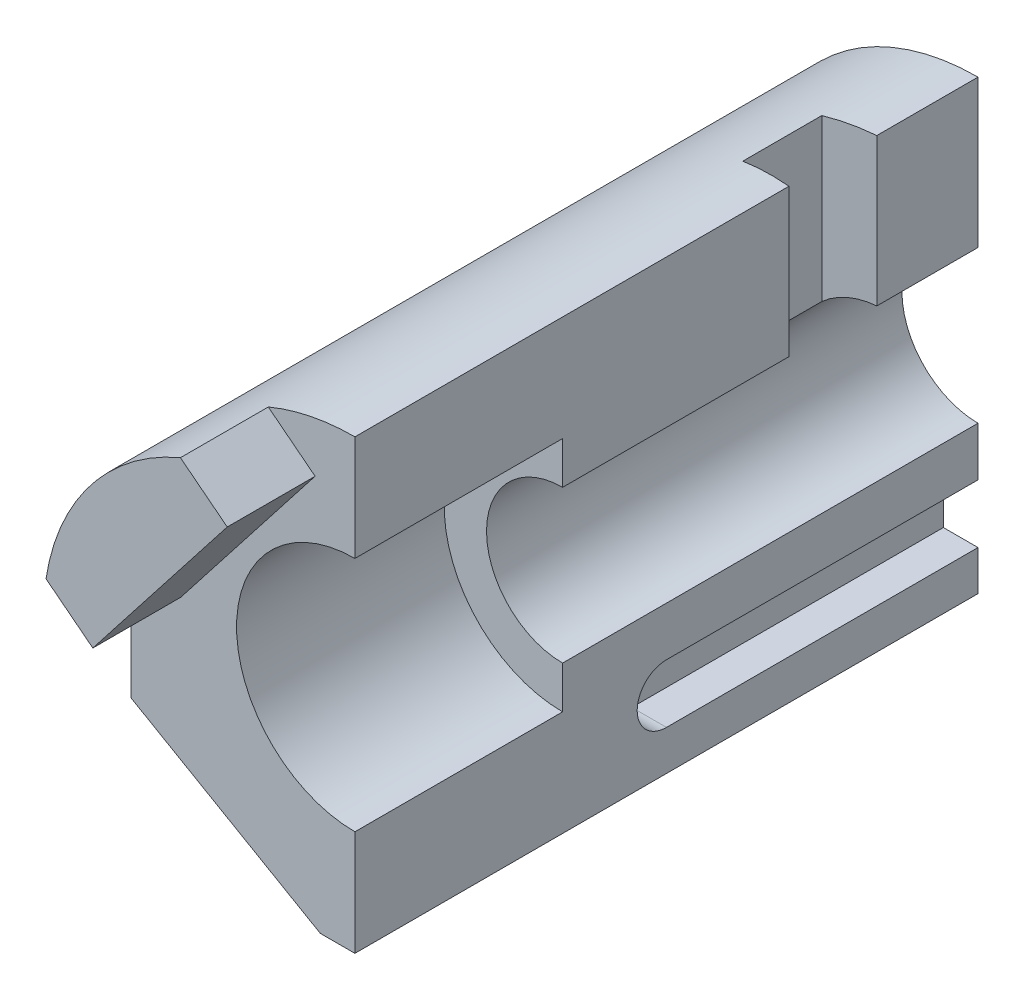
ISO-10303-21;
HEADER;
FILE_DESCRIPTION(('STEP AP214'),'2;1');
FILE_NAME('part.step','',(''),(''),'','','');
FILE_SCHEMA(('AUTOMOTIVE_DESIGN { 1 0 10303 214 1 1 1 1 }'));
ENDSEC;
DATA;
#1=APPLICATION_CONTEXT('core data for automotive mechanical design processes');
#2=APPLICATION_PROTOCOL_DEFINITION('international standard','automotive_design',2000,#1);
#3=PRODUCT_CONTEXT('',#1,'mechanical');
#4=PRODUCT('Part','Part','',(#3));
#5=PRODUCT_RELATED_PRODUCT_CATEGORY('part','',(#4));
#6=PRODUCT_DEFINITION_FORMATION('','',#4);
#7=PRODUCT_DEFINITION_CONTEXT('part definition',#1,'design');
#8=PRODUCT_DEFINITION('design','',#6,#7);
#9=PRODUCT_DEFINITION_SHAPE('','',#8);
#10=(LENGTH_UNIT() NAMED_UNIT(*) SI_UNIT(.MILLI.,.METRE.));
#11=(NAMED_UNIT(*) PLANE_ANGLE_UNIT() SI_UNIT($,.RADIAN.));
#12=(NAMED_UNIT(*) SI_UNIT($,.STERADIAN.) SOLID_ANGLE_UNIT());
#13=UNCERTAINTY_MEASURE_WITH_UNIT(LENGTH_MEASURE(1.E-05),#10,'distance_accuracy_value','');
#14=(GEOMETRIC_REPRESENTATION_CONTEXT(3) GLOBAL_UNCERTAINTY_ASSIGNED_CONTEXT((#13)) GLOBAL_UNIT_ASSIGNED_CONTEXT((#10,
#11,#12)) REPRESENTATION_CONTEXT('',''));
#15=CARTESIAN_POINT('',(0.,0.,0.));
#16=DIRECTION('',(0.,0.,1.));
#17=DIRECTION('',(1.,0.,0.));
#18=AXIS2_PLACEMENT_3D('',#15,#16,#17);
#19=CARTESIAN_POINT('',(0.,168.,-234.));
#20=DIRECTION('',(1.,0.,0.));
#21=DIRECTION('',(0.,1.,0.));
#22=AXIS2_PLACEMENT_3D('',#19,#20,#21);
#23=PLANE('',#22);
#24=DIRECTION('',(0.,1.,0.));
#25=VECTOR('',#24,1.);
#26=CARTESIAN_POINT('',(0.,-0.001000000000001,-163.));
#27=LINE('',#26,#25);
#28=CARTESIAN_POINT('',(0.,112.575,-163.));
#29=VERTEX_POINT('',#28);
#30=CARTESIAN_POINT('',(0.,168.,-163.));
#31=VERTEX_POINT('',#30);
#32=EDGE_CURVE('E191',#29,#31,#27,.T.);
#33=ORIENTED_EDGE('',*,*,#32,.T.);
#34=DIRECTION('',(0.,0.,1.));
#35=VECTOR('',#34,1.);
#36=CARTESIAN_POINT('',(0.,168.,-234.));
#37=LINE('',#36,#35);
#38=CARTESIAN_POINT('',(0.,168.,0.));
#39=VERTEX_POINT('',#38);
#40=EDGE_CURVE('E297',#31,#39,#37,.T.);
#41=ORIENTED_EDGE('',*,*,#40,.T.);
#42=DIRECTION('',(0.,1.,0.));
#43=VECTOR('',#42,1.);
#44=CARTESIAN_POINT('',(0.,168.,0.));
#45=LINE('',#44,#43);
#46=CARTESIAN_POINT('',(0.,128.45,0.));
#47=VERTEX_POINT('',#46);
#48=EDGE_CURVE('E279',#47,#39,#45,.T.);
#49=ORIENTED_EDGE('',*,*,#48,.F.);
#50=DIRECTION('',(0.,0.,1.));
#51=VECTOR('',#50,1.);
#52=CARTESIAN_POINT('',(0.,128.45,-78.));
#53=LINE('',#52,#51);
#54=CARTESIAN_POINT('',(0.,128.45,-78.));
#55=VERTEX_POINT('',#54);
#56=EDGE_CURVE('E277',#55,#47,#53,.T.);
#57=ORIENTED_EDGE('',*,*,#56,.F.);
#58=DIRECTION('',(0.,-1.,0.));
#59=VECTOR('',#58,1.);
#60=CARTESIAN_POINT('',(0.,168.,-78.));
#61=LINE('',#60,#59);
#62=CARTESIAN_POINT('',(0.,112.575,-78.));
#63=VERTEX_POINT('',#62);
#64=EDGE_CURVE('E326',#55,#63,#61,.T.);
#65=ORIENTED_EDGE('',*,*,#64,.T.);
#66=DIRECTION('',(0.,0.,1.));
#67=VECTOR('',#66,1.);
#68=CARTESIAN_POINT('',(0.,112.575,-234.));
#69=LINE('',#68,#67);
#70=EDGE_CURVE('E267',#29,#63,#69,.T.);
#71=ORIENTED_EDGE('',*,*,#70,.F.);
#72=EDGE_LOOP('',(#33,#41,#49,#57,#65,#71));
#73=FACE_BOUND('',#72,.T.);
#74=ADVANCED_FACE('F37',(#73),#23,.T.);
#75=CARTESIAN_POINT('',(0.,84.,0.));
#76=DIRECTION('',(0.,0.,-1.));
#77=DIRECTION('',(-1.,0.,0.));
#78=AXIS2_PLACEMENT_3D('',#75,#76,#77);
#79=PLANE('',#78);
#80=DIRECTION('',(0.788010753606726,-0.615661475325653,0.));
#81=VECTOR('',#80,1.);
#82=CARTESIAN_POINT('',(-65.4306689222948,83.0902943437326,0.));
#83=LINE('',#82,#81);
#84=CARTESIAN_POINT('',(-83.0146493790291,96.8284055313539,0.));
#85=VERTEX_POINT('',#84);
#86=CARTESIAN_POINT('',(-65.4306689222948,83.0902943437326,0.));
#87=VERTEX_POINT('',#86);
#88=EDGE_CURVE('E213',#85,#87,#83,.T.);
#89=ORIENTED_EDGE('',*,*,#88,.F.);
#90=CARTESIAN_POINT('',(0.,84.,0.));
#91=DIRECTION('',(0.,0.,1.));
#92=DIRECTION('',(-1.,0.,0.));
#93=AXIS2_PLACEMENT_3D('',#90,#91,#92);
#94=CIRCLE('',#93,84.);
#95=CARTESIAN_POINT('',(-84.,84.,0.));
#96=VERTEX_POINT('',#95);
#97=EDGE_CURVE('E301',#85,#96,#94,.T.);
#98=ORIENTED_EDGE('',*,*,#97,.T.);
#99=DIRECTION('',(0.,-1.,0.));
#100=VECTOR('',#99,1.);
#101=CARTESIAN_POINT('',(-84.,40.9918691124636,0.));
#102=LINE('',#101,#100);
#103=CARTESIAN_POINT('',(-84.,40.9918691124636,0.));
#104=VERTEX_POINT('',#103);
#105=EDGE_CURVE('E304',#96,#104,#102,.T.);
#106=ORIENTED_EDGE('',*,*,#105,.T.);
#107=DIRECTION('',(0.866025403784438,-0.500000000000001,0.));
#108=VECTOR('',#107,1.);
#109=CARTESIAN_POINT('',(-13.,0.,0.));
#110=LINE('',#109,#108);
#111=CARTESIAN_POINT('',(-13.,0.,0.));
#112=VERTEX_POINT('',#111);
#113=EDGE_CURVE('E307',#104,#112,#110,.T.);
#114=ORIENTED_EDGE('',*,*,#113,.T.);
#115=DIRECTION('',(1.,0.,0.));
#116=VECTOR('',#115,1.);
#117=CARTESIAN_POINT('',(0.,0.,0.));
#118=LINE('',#117,#116);
#119=CARTESIAN_POINT('',(0.,0.,0.));
#120=VERTEX_POINT('',#119);
#121=EDGE_CURVE('E310',#112,#120,#118,.T.);
#122=ORIENTED_EDGE('',*,*,#121,.T.);
#123=CARTESIAN_POINT('',(0.,39.55,0.));
#124=VERTEX_POINT('',#123);
#125=EDGE_CURVE('E298',#120,#124,#45,.T.);
#126=ORIENTED_EDGE('',*,*,#125,.T.);
#127=CARTESIAN_POINT('',(0.,84.,0.));
#128=DIRECTION('',(0.,0.,1.));
#129=DIRECTION('',(1.,0.,0.));
#130=AXIS2_PLACEMENT_3D('',#127,#128,#129);
#131=CIRCLE('',#130,44.45);
#132=EDGE_CURVE('E269',#47,#124,#131,.T.);
#133=ORIENTED_EDGE('',*,*,#132,.F.);
#134=ORIENTED_EDGE('',*,*,#48,.T.);
#135=CARTESIAN_POINT('',(-32.5304084023255,161.445287327105,0.));
#136=VERTEX_POINT('',#135);
#137=EDGE_CURVE('E302',#39,#136,#94,.T.);
#138=ORIENTED_EDGE('',*,*,#137,.T.);
#139=DIRECTION('',(-0.788010753606725,0.615661475325654,0.));
#140=VECTOR('',#139,1.);
#141=CARTESIAN_POINT('',(-14.9464279455912,147.707176139484,0.));
#142=LINE('',#141,#140);
#143=CARTESIAN_POINT('',(-14.9464279455912,147.707176139484,0.));
#144=VERTEX_POINT('',#143);
#145=EDGE_CURVE('E221',#144,#136,#142,.T.);
#146=ORIENTED_EDGE('',*,*,#145,.F.);
#147=DIRECTION('',(0.615661475325654,0.788010753606725,0.));
#148=VECTOR('',#147,1.);
#149=CARTESIAN_POINT('',(-40.188548433943,115.398735241608,0.));
#150=LINE('',#149,#148);
#151=EDGE_CURVE('E60',#87,#144,#150,.T.);
#152=ORIENTED_EDGE('',*,*,#151,.F.);
#153=EDGE_LOOP('',(#89,#98,#106,#114,#122,#126,#133,#134,#138,#146,#152));
#154=FACE_BOUND('',#153,.T.);
#155=ADVANCED_FACE('F350',(#154),#79,.F.);
#156=DIRECTION('',(0.,1.,0.));
#157=VECTOR('',#156,1.);
#158=CARTESIAN_POINT('',(0.,-0.001000000000001,-196.));
#159=LINE('',#158,#157);
#160=CARTESIAN_POINT('',(0.,112.575,-196.));
#161=VERTEX_POINT('',#160);
#162=CARTESIAN_POINT('',(0.,168.,-196.));
#163=VERTEX_POINT('',#162);
#164=EDGE_CURVE('E591',#161,#163,#159,.T.);
#165=ORIENTED_EDGE('',*,*,#164,.F.);
#166=CARTESIAN_POINT('',(0.,112.575,-234.));
#167=VERTEX_POINT('',#166);
#168=EDGE_CURVE('E201',#167,#161,#69,.T.);
#169=ORIENTED_EDGE('',*,*,#168,.F.);
#170=DIRECTION('',(0.,1.,0.));
#171=VECTOR('',#170,1.);
#172=CARTESIAN_POINT('',(0.,168.,-234.));
#173=LINE('',#172,#171);
#174=CARTESIAN_POINT('',(0.,168.,-234.));
#175=VERTEX_POINT('',#174);
#176=EDGE_CURVE('E285',#167,#175,#173,.T.);
#177=ORIENTED_EDGE('',*,*,#176,.T.);
#178=EDGE_CURVE('E323',#175,#163,#37,.T.);
#179=ORIENTED_EDGE('',*,*,#178,.T.);
#180=EDGE_LOOP('',(#165,#169,#177,#179));
#181=FACE_BOUND('',#180,.T.);
#182=ADVANCED_FACE('F400',(#181),#23,.T.);
#183=DIRECTION('',(0.,0.,-1.));
#184=VECTOR('',#183,1.);
#185=CARTESIAN_POINT('',(0.,15.0000000000001,-234.));
#186=LINE('',#185,#184);
#187=CARTESIAN_POINT('',(0.,15.0000000000001,-117.));
#188=VERTEX_POINT('',#187);
#189=CARTESIAN_POINT('',(0.,15.0000000000001,-234.));
#190=VERTEX_POINT('',#189);
#191=EDGE_CURVE('E241',#188,#190,#186,.T.);
#192=ORIENTED_EDGE('',*,*,#191,.F.);
#193=CARTESIAN_POINT('',(0.,26.0000000000001,-117.));
#194=DIRECTION('',(1.,0.,0.));
#195=DIRECTION('',(0.,1.,0.));
#196=AXIS2_PLACEMENT_3D('',#193,#194,#195);
#197=CIRCLE('',#196,10.9999999999999);
#198=CARTESIAN_POINT('',(0.,37.,-117.));
#199=VERTEX_POINT('',#198);
#200=EDGE_CURVE('E249',#199,#188,#197,.T.);
#201=ORIENTED_EDGE('',*,*,#200,.F.);
#202=DIRECTION('',(0.,0.,1.));
#203=VECTOR('',#202,1.);
#204=CARTESIAN_POINT('',(0.,37.0000000000001,-234.));
#205=LINE('',#204,#203);
#206=CARTESIAN_POINT('',(0.,37.0000000000001,-234.));
#207=VERTEX_POINT('',#206);
#208=EDGE_CURVE('E236',#207,#199,#205,.T.);
#209=ORIENTED_EDGE('',*,*,#208,.F.);
#210=CARTESIAN_POINT('',(0.,55.425,-234.));
#211=VERTEX_POINT('',#210);
#212=EDGE_CURVE('E284',#207,#211,#173,.T.);
#213=ORIENTED_EDGE('',*,*,#212,.T.);
#214=DIRECTION('',(0.,0.,1.));
#215=VECTOR('',#214,1.);
#216=CARTESIAN_POINT('',(0.,55.425,-234.));
#217=LINE('',#216,#215);
#218=CARTESIAN_POINT('',(0.,55.425,-78.));
#219=VERTEX_POINT('',#218);
#220=EDGE_CURVE('E264',#219,#211,#217,.F.);
#221=ORIENTED_EDGE('',*,*,#220,.F.);
#222=CARTESIAN_POINT('',(0.,39.55,-78.));
#223=VERTEX_POINT('',#222);
#224=EDGE_CURVE('E315',#219,#223,#61,.T.);
#225=ORIENTED_EDGE('',*,*,#224,.T.);
#226=DIRECTION('',(0.,0.,1.));
#227=VECTOR('',#226,1.);
#228=CARTESIAN_POINT('',(0.,39.55,-78.));
#229=LINE('',#228,#227);
#230=EDGE_CURVE('E273',#124,#223,#229,.F.);
#231=ORIENTED_EDGE('',*,*,#230,.F.);
#232=ORIENTED_EDGE('',*,*,#125,.F.);
#233=DIRECTION('',(0.,0.,1.));
#234=VECTOR('',#233,1.);
#235=CARTESIAN_POINT('',(0.,0.,-234.));
#236=LINE('',#235,#234);
#237=CARTESIAN_POINT('',(0.,0.,-234.));
#238=VERTEX_POINT('',#237);
#239=EDGE_CURVE('E313',#238,#120,#236,.T.);
#240=ORIENTED_EDGE('',*,*,#239,.F.);
#241=EDGE_CURVE('E280',#238,#190,#173,.T.);
#242=ORIENTED_EDGE('',*,*,#241,.T.);
#243=EDGE_LOOP('',(#192,#201,#209,#213,#221,#225,#231,#232,#240,#242));
#244=FACE_BOUND('',#243,.T.);
#245=ADVANCED_FACE('F39',(#244),#23,.T.);
#246=CARTESIAN_POINT('',(0.,0.,-234.));
#247=DIRECTION('',(0.,-1.,0.));
#248=DIRECTION('',(1.,0.,0.));
#249=AXIS2_PLACEMENT_3D('',#246,#247,#248);
#250=PLANE('',#249);
#251=ORIENTED_EDGE('',*,*,#121,.F.);
#252=DIRECTION('',(0.,0.,1.));
#253=VECTOR('',#252,1.);
#254=CARTESIAN_POINT('',(-13.,0.,-234.));
#255=LINE('',#254,#253);
#256=CARTESIAN_POINT('',(-13.,0.,-234.));
#257=VERTEX_POINT('',#256);
#258=EDGE_CURVE('E316',#257,#112,#255,.T.);
#259=ORIENTED_EDGE('',*,*,#258,.F.);
#260=DIRECTION('',(1.,0.,0.));
#261=VECTOR('',#260,1.);
#262=CARTESIAN_POINT('',(0.,0.,-234.));
#263=LINE('',#262,#261);
#264=EDGE_CURVE('E294',#257,#238,#263,.T.);
#265=ORIENTED_EDGE('',*,*,#264,.T.);
#266=ORIENTED_EDGE('',*,*,#239,.T.);
#267=EDGE_LOOP('',(#251,#259,#265,#266));
#268=FACE_BOUND('',#267,.T.);
#269=ADVANCED_FACE('F379',(#268),#250,.T.);
#270=CARTESIAN_POINT('',(-13.,0.,-234.));
#271=DIRECTION('',(-0.500000000000001,-0.866025403784438,0.));
#272=DIRECTION('',(0.866025403784438,-0.500000000000001,0.));
#273=AXIS2_PLACEMENT_3D('',#270,#271,#272);
#274=PLANE('',#273);
#275=ORIENTED_EDGE('',*,*,#113,.F.);
#276=DIRECTION('',(0.,0.,1.));
#277=VECTOR('',#276,1.);
#278=CARTESIAN_POINT('',(-84.,40.9918691124636,-234.));
#279=LINE('',#278,#277);
#280=CARTESIAN_POINT('',(-84.,40.9918691124636,-234.));
#281=VERTEX_POINT('',#280);
#282=EDGE_CURVE('E318',#281,#104,#279,.T.);
#283=ORIENTED_EDGE('',*,*,#282,.F.);
#284=DIRECTION('',(0.866025403784438,-0.500000000000001,0.));
#285=VECTOR('',#284,1.);
#286=CARTESIAN_POINT('',(-13.,0.,-234.));
#287=LINE('',#286,#285);
#288=EDGE_CURVE('E291',#281,#257,#287,.T.);
#289=ORIENTED_EDGE('',*,*,#288,.T.);
#290=ORIENTED_EDGE('',*,*,#258,.T.);
#291=EDGE_LOOP('',(#275,#283,#289,#290));
#292=FACE_BOUND('',#291,.T.);
#293=ADVANCED_FACE('F401',(#292),#274,.T.);
#294=CARTESIAN_POINT('',(-84.,40.9918691124636,-234.));
#295=DIRECTION('',(-1.,0.,0.));
#296=DIRECTION('',(0.,0.,1.));
#297=AXIS2_PLACEMENT_3D('',#294,#295,#296);
#298=PLANE('',#297);
#299=ORIENTED_EDGE('',*,*,#105,.F.);
#300=DIRECTION('',(0.,0.,1.));
#301=VECTOR('',#300,1.);
#302=CARTESIAN_POINT('',(-84.,84.,-234.));
#303=LINE('',#302,#301);
#304=CARTESIAN_POINT('',(-84.,84.,-234.));
#305=VERTEX_POINT('',#304);
#306=EDGE_CURVE('E320',#305,#96,#303,.T.);
#307=ORIENTED_EDGE('',*,*,#306,.F.);
#308=DIRECTION('',(0.,-1.,0.));
#309=VECTOR('',#308,1.);
#310=CARTESIAN_POINT('',(-84.,40.9918691124636,-234.));
#311=LINE('',#310,#309);
#312=EDGE_CURVE('E288',#305,#281,#311,.T.);
#313=ORIENTED_EDGE('',*,*,#312,.T.);
#314=ORIENTED_EDGE('',*,*,#282,.T.);
#315=EDGE_LOOP('',(#299,#307,#313,#314));
#316=FACE_BOUND('',#315,.T.);
#317=ADVANCED_FACE('F374',(#316),#298,.T.);
#318=CARTESIAN_POINT('',(0.,84.,-234.));
#319=DIRECTION('',(0.,0.,1.));
#320=DIRECTION('',(1.,0.,0.));
#321=AXIS2_PLACEMENT_3D('',#318,#319,#320);
#322=CYLINDRICAL_SURFACE('',#321,84.);
#323=CARTESIAN_POINT('',(0.,84.,-163.));
#324=DIRECTION('',(-0.0871557427476508,0.,0.996194698091746));
#325=DIRECTION('',(0.996194698091746,0.,0.0871557427476508));
#326=AXIS2_PLACEMENT_3D('',#323,#324,#325);
#327=ELLIPSE('',#326,84.3208663536411,84.);
#328=CARTESIAN_POINT('',(-19.,165.822979657307,-164.662284606992));
#329=VERTEX_POINT('',#328);
#330=EDGE_CURVE('E208',#329,#31,#327,.F.);
#331=ORIENTED_EDGE('',*,*,#330,.F.);
#332=DIRECTION('',(0.,0.,1.));
#333=VECTOR('',#332,1.);
#334=CARTESIAN_POINT('',(-19.,165.822979657307,-234.));
#335=LINE('',#334,#333);
#336=CARTESIAN_POINT('',(-19.,165.822979657307,-194.337715393007));
#337=VERTEX_POINT('',#336);
#338=EDGE_CURVE('E202',#337,#329,#335,.T.);
#339=ORIENTED_EDGE('',*,*,#338,.F.);
#340=CARTESIAN_POINT('',(0.,84.,-196.));
#341=DIRECTION('',(-0.087155742747658,0.,-0.996194698091746));
#342=DIRECTION('',(-0.996194698091746,0.,0.087155742747658));
#343=AXIS2_PLACEMENT_3D('',#340,#341,#342);
#344=ELLIPSE('',#343,84.3208663536412,84.);
#345=EDGE_CURVE('E187',#163,#337,#344,.F.);
#346=ORIENTED_EDGE('',*,*,#345,.F.);
#347=ORIENTED_EDGE('',*,*,#178,.F.);
#348=CARTESIAN_POINT('',(0.,84.,-234.));
#349=DIRECTION('',(0.,0.,1.));
#350=DIRECTION('',(-1.,0.,0.));
#351=AXIS2_PLACEMENT_3D('',#348,#349,#350);
#352=CIRCLE('',#351,84.);
#353=EDGE_CURVE('E283',#175,#305,#352,.T.);
#354=ORIENTED_EDGE('',*,*,#353,.T.);
#355=ORIENTED_EDGE('',*,*,#306,.T.);
#356=ORIENTED_EDGE('',*,*,#97,.F.);
#357=DIRECTION('',(0.,0.,-1.));
#358=VECTOR('',#357,1.);
#359=CARTESIAN_POINT('',(-83.0146493790291,96.8284055313539,33.));
#360=LINE('',#359,#358);
#361=CARTESIAN_POINT('',(-83.0146493790291,96.8284055313539,33.));
#362=VERTEX_POINT('',#361);
#363=EDGE_CURVE('E227',#362,#85,#360,.T.);
#364=ORIENTED_EDGE('',*,*,#363,.F.);
#365=CARTESIAN_POINT('',(0.,84.,33.));
#366=DIRECTION('',(0.,0.,1.));
#367=DIRECTION('',(1.,0.,0.));
#368=AXIS2_PLACEMENT_3D('',#365,#366,#367);
#369=CIRCLE('',#368,84.);
#370=CARTESIAN_POINT('',(-32.5304084023255,161.445287327105,33.));
#371=VERTEX_POINT('',#370);
#372=EDGE_CURVE('E215',#371,#362,#369,.T.);
#373=ORIENTED_EDGE('',*,*,#372,.F.);
#374=DIRECTION('',(0.,0.,-1.));
#375=VECTOR('',#374,1.);
#376=CARTESIAN_POINT('',(-32.5304084023255,161.445287327105,33.));
#377=LINE('',#376,#375);
#378=EDGE_CURVE('E230',#371,#136,#377,.T.);
#379=ORIENTED_EDGE('',*,*,#378,.T.);
#380=ORIENTED_EDGE('',*,*,#137,.F.);
#381=ORIENTED_EDGE('',*,*,#40,.F.);
#382=EDGE_LOOP('',(#331,#339,#346,#347,#354,#355,#356,#364,#373,#379,#380,#381));
#383=FACE_BOUND('',#382,.T.);
#384=ADVANCED_FACE('F353',(#383),#322,.T.);
#385=CARTESIAN_POINT('',(0.,84.,-234.));
#386=DIRECTION('',(0.,0.,-1.));
#387=DIRECTION('',(-1.,0.,0.));
#388=AXIS2_PLACEMENT_3D('',#385,#386,#387);
#389=PLANE('',#388);
#390=DIRECTION('',(1.,0.,0.));
#391=VECTOR('',#390,1.);
#392=CARTESIAN_POINT('',(-13.,15.0000000000001,-234.));
#393=LINE('',#392,#391);
#394=CARTESIAN_POINT('',(-13.,15.,-234.));
#395=VERTEX_POINT('',#394);
#396=EDGE_CURVE('E253',#395,#190,#393,.T.);
#397=ORIENTED_EDGE('',*,*,#396,.T.);
#398=ORIENTED_EDGE('',*,*,#241,.F.);
#399=ORIENTED_EDGE('',*,*,#264,.F.);
#400=ORIENTED_EDGE('',*,*,#288,.F.);
#401=ORIENTED_EDGE('',*,*,#312,.F.);
#402=ORIENTED_EDGE('',*,*,#353,.F.);
#403=ORIENTED_EDGE('',*,*,#176,.F.);
#404=CARTESIAN_POINT('',(0.,84.,-234.));
#405=DIRECTION('',(0.,0.,1.));
#406=DIRECTION('',(1.,0.,0.));
#407=AXIS2_PLACEMENT_3D('',#404,#405,#406);
#408=CIRCLE('',#407,28.575);
#409=EDGE_CURVE('E256',#167,#211,#408,.T.);
#410=ORIENTED_EDGE('',*,*,#409,.T.);
#411=ORIENTED_EDGE('',*,*,#212,.F.);
#412=DIRECTION('',(1.,0.,0.));
#413=VECTOR('',#412,1.);
#414=CARTESIAN_POINT('',(-13.,37.0000000000001,-234.));
#415=LINE('',#414,#413);
#416=CARTESIAN_POINT('',(-13.,37.0000000000001,-234.));
#417=VERTEX_POINT('',#416);
#418=EDGE_CURVE('E246',#417,#207,#415,.T.);
#419=ORIENTED_EDGE('',*,*,#418,.F.);
#420=DIRECTION('',(0.,-1.,0.));
#421=VECTOR('',#420,1.);
#422=CARTESIAN_POINT('',(-13.,84.,-234.));
#423=LINE('',#422,#421);
#424=EDGE_CURVE('E11',#417,#395,#423,.T.);
#425=ORIENTED_EDGE('',*,*,#424,.T.);
#426=EDGE_LOOP('',(#397,#398,#399,#400,#401,#402,#403,#410,#411,#419,#425));
#427=FACE_BOUND('',#426,.T.);
#428=ADVANCED_FACE('F384',(#427),#389,.T.);
#429=CARTESIAN_POINT('',(0.,84.,-78.));
#430=DIRECTION('',(0.,0.,1.));
#431=DIRECTION('',(1.,0.,0.));
#432=AXIS2_PLACEMENT_3D('',#429,#430,#431);
#433=CYLINDRICAL_SURFACE('',#432,44.45);
#434=ORIENTED_EDGE('',*,*,#56,.T.);
#435=ORIENTED_EDGE('',*,*,#132,.T.);
#436=ORIENTED_EDGE('',*,*,#230,.T.);
#437=CARTESIAN_POINT('',(0.,84.,-78.));
#438=DIRECTION('',(0.,0.,1.));
#439=DIRECTION('',(1.,0.,0.));
#440=AXIS2_PLACEMENT_3D('',#437,#438,#439);
#441=CIRCLE('',#440,44.45);
#442=EDGE_CURVE('E270',#55,#223,#441,.T.);
#443=ORIENTED_EDGE('',*,*,#442,.F.);
#444=EDGE_LOOP('',(#434,#435,#436,#443));
#445=FACE_BOUND('',#444,.T.);
#446=ADVANCED_FACE('F342',(#445),#433,.F.);
#447=CARTESIAN_POINT('',(0.,84.,-78.));
#448=DIRECTION('',(0.,0.,1.));
#449=DIRECTION('',(1.,0.,0.));
#450=AXIS2_PLACEMENT_3D('',#447,#448,#449);
#451=PLANE('',#450);
#452=CARTESIAN_POINT('',(0.,84.,-78.));
#453=DIRECTION('',(0.,0.,1.));
#454=DIRECTION('',(1.,0.,0.));
#455=AXIS2_PLACEMENT_3D('',#452,#453,#454);
#456=CIRCLE('',#455,28.575);
#457=EDGE_CURVE('E45',#63,#219,#456,.T.);
#458=ORIENTED_EDGE('',*,*,#457,.F.);
#459=ORIENTED_EDGE('',*,*,#64,.F.);
#460=ORIENTED_EDGE('',*,*,#442,.T.);
#461=ORIENTED_EDGE('',*,*,#224,.F.);
#462=EDGE_LOOP('',(#458,#459,#460,#461));
#463=FACE_BOUND('',#462,.T.);
#464=ADVANCED_FACE('F338',(#463),#451,.T.);
#465=CARTESIAN_POINT('',(0.,84.,-234.));
#466=DIRECTION('',(0.,0.,1.));
#467=DIRECTION('',(1.,0.,0.));
#468=AXIS2_PLACEMENT_3D('',#465,#466,#467);
#469=CYLINDRICAL_SURFACE('',#468,28.575);
#470=DIRECTION('',(0.,0.,1.));
#471=VECTOR('',#470,1.);
#472=CARTESIAN_POINT('',(-19.,105.343163425322,-234.));
#473=LINE('',#472,#471);
#474=CARTESIAN_POINT('',(-19.,105.343163425322,-164.662284606992));
#475=VERTEX_POINT('',#474);
#476=CARTESIAN_POINT('',(-19.,105.343163425322,-194.337715393007));
#477=VERTEX_POINT('',#476);
#478=EDGE_CURVE('E194',#475,#477,#473,.F.);
#479=ORIENTED_EDGE('',*,*,#478,.F.);
#480=CARTESIAN_POINT('',(0.,84.,-163.));
#481=DIRECTION('',(-0.0871557427476508,0.,0.996194698091746));
#482=DIRECTION('',(0.996194698091746,0.,0.0871557427476508));
#483=AXIS2_PLACEMENT_3D('',#480,#481,#482);
#484=ELLIPSE('',#483,28.6841518578011,28.575);
#485=EDGE_CURVE('E52',#29,#475,#484,.T.);
#486=ORIENTED_EDGE('',*,*,#485,.F.);
#487=ORIENTED_EDGE('',*,*,#70,.T.);
#488=ORIENTED_EDGE('',*,*,#457,.T.);
#489=ORIENTED_EDGE('',*,*,#220,.T.);
#490=ORIENTED_EDGE('',*,*,#409,.F.);
#491=ORIENTED_EDGE('',*,*,#168,.T.);
#492=CARTESIAN_POINT('',(0.,84.,-196.));
#493=DIRECTION('',(-0.087155742747658,0.,-0.996194698091746));
#494=DIRECTION('',(-0.996194698091746,0.,0.087155742747658));
#495=AXIS2_PLACEMENT_3D('',#492,#493,#494);
#496=ELLIPSE('',#495,28.6841518578012,28.575);
#497=EDGE_CURVE('E184',#477,#161,#496,.T.);
#498=ORIENTED_EDGE('',*,*,#497,.F.);
#499=EDGE_LOOP('',(#479,#486,#487,#488,#489,#490,#491,#498));
#500=FACE_BOUND('',#499,.T.);
#501=ADVANCED_FACE('F199',(#500),#469,.F.);
#502=CARTESIAN_POINT('',(-13.,15.0000000000001,-234.));
#503=DIRECTION('',(0.,-1.,0.));
#504=DIRECTION('',(1.,0.,0.));
#505=AXIS2_PLACEMENT_3D('',#502,#503,#504);
#506=PLANE('',#505);
#507=ORIENTED_EDGE('',*,*,#191,.T.);
#508=ORIENTED_EDGE('',*,*,#396,.F.);
#509=DIRECTION('',(0.,0.,-1.));
#510=VECTOR('',#509,1.);
#511=CARTESIAN_POINT('',(-13.,15.0000000000001,-234.));
#512=LINE('',#511,#510);
#513=CARTESIAN_POINT('',(-13.,15.0000000000001,-117.));
#514=VERTEX_POINT('',#513);
#515=EDGE_CURVE('E244',#514,#395,#512,.T.);
#516=ORIENTED_EDGE('',*,*,#515,.F.);
#517=DIRECTION('',(1.,0.,0.));
#518=VECTOR('',#517,1.);
#519=CARTESIAN_POINT('',(-13.,15.0000000000001,-117.));
#520=LINE('',#519,#518);
#521=EDGE_CURVE('E257',#514,#188,#520,.T.);
#522=ORIENTED_EDGE('',*,*,#521,.T.);
#523=EDGE_LOOP('',(#507,#508,#516,#522));
#524=FACE_BOUND('',#523,.T.);
#525=ADVANCED_FACE('F390',(#524),#506,.F.);
#526=CARTESIAN_POINT('',(-13.,26.0000000000001,-117.));
#527=DIRECTION('',(1.,0.,0.));
#528=DIRECTION('',(0.,1.,0.));
#529=AXIS2_PLACEMENT_3D('',#526,#527,#528);
#530=CYLINDRICAL_SURFACE('',#529,10.9999999999999);
#531=ORIENTED_EDGE('',*,*,#200,.T.);
#532=ORIENTED_EDGE('',*,*,#521,.F.);
#533=CARTESIAN_POINT('',(-13.,26.0000000000001,-117.));
#534=DIRECTION('',(1.,0.,0.));
#535=DIRECTION('',(0.,1.,0.));
#536=AXIS2_PLACEMENT_3D('',#533,#534,#535);
#537=CIRCLE('',#536,10.9999999999999);
#538=CARTESIAN_POINT('',(-13.,37.,-117.));
#539=VERTEX_POINT('',#538);
#540=EDGE_CURVE('E240',#539,#514,#537,.T.);
#541=ORIENTED_EDGE('',*,*,#540,.F.);
#542=DIRECTION('',(1.,0.,0.));
#543=VECTOR('',#542,1.);
#544=CARTESIAN_POINT('',(-13.,37.,-117.));
#545=LINE('',#544,#543);
#546=EDGE_CURVE('E259',#539,#199,#545,.T.);
#547=ORIENTED_EDGE('',*,*,#546,.T.);
#548=EDGE_LOOP('',(#531,#532,#541,#547));
#549=FACE_BOUND('',#548,.T.);
#550=ADVANCED_FACE('F393',(#549),#530,.F.);
#551=CARTESIAN_POINT('',(-13.,37.0000000000001,-234.));
#552=DIRECTION('',(0.,1.,0.));
#553=DIRECTION('',(0.,0.,1.));
#554=AXIS2_PLACEMENT_3D('',#551,#552,#553);
#555=PLANE('',#554);
#556=ORIENTED_EDGE('',*,*,#208,.T.);
#557=ORIENTED_EDGE('',*,*,#546,.F.);
#558=DIRECTION('',(0.,0.,1.));
#559=VECTOR('',#558,1.);
#560=CARTESIAN_POINT('',(-13.,37.0000000000001,-234.));
#561=LINE('',#560,#559);
#562=EDGE_CURVE('E237',#417,#539,#561,.T.);
#563=ORIENTED_EDGE('',*,*,#562,.F.);
#564=ORIENTED_EDGE('',*,*,#418,.T.);
#565=EDGE_LOOP('',(#556,#557,#563,#564));
#566=FACE_BOUND('',#565,.T.);
#567=ADVANCED_FACE('F397',(#566),#555,.F.);
#568=CARTESIAN_POINT('',(-13.,26.,-234.));
#569=DIRECTION('',(1.,0.,0.));
#570=DIRECTION('',(0.,1.,0.));
#571=AXIS2_PLACEMENT_3D('',#568,#569,#570);
#572=PLANE('',#571);
#573=ORIENTED_EDGE('',*,*,#562,.T.);
#574=ORIENTED_EDGE('',*,*,#540,.T.);
#575=ORIENTED_EDGE('',*,*,#515,.T.);
#576=ORIENTED_EDGE('',*,*,#424,.F.);
#577=EDGE_LOOP('',(#573,#574,#575,#576));
#578=FACE_BOUND('',#577,.T.);
#579=ADVANCED_FACE('F485',(#578),#572,.T.);
#580=CARTESIAN_POINT('',(-40.188548433943,115.398735241608,33.));
#581=DIRECTION('',(-0.788010753606725,0.615661475325654,0.));
#582=DIRECTION('',(-0.615661475325654,-0.788010753606725,0.));
#583=AXIS2_PLACEMENT_3D('',#580,#581,#582);
#584=PLANE('',#583);
#585=ORIENTED_EDGE('',*,*,#151,.T.);
#586=DIRECTION('',(0.,0.,-1.));
#587=VECTOR('',#586,1.);
#588=CARTESIAN_POINT('',(-14.9464279455912,147.707176139484,33.));
#589=LINE('',#588,#587);
#590=CARTESIAN_POINT('',(-14.9464279455912,147.707176139484,33.));
#591=VERTEX_POINT('',#590);
#592=EDGE_CURVE('E233',#591,#144,#589,.T.);
#593=ORIENTED_EDGE('',*,*,#592,.F.);
#594=DIRECTION('',(0.615661475325653,0.788010753606726,0.));
#595=VECTOR('',#594,1.);
#596=CARTESIAN_POINT('',(-40.188548433943,115.398735241608,33.));
#597=LINE('',#596,#595);
#598=CARTESIAN_POINT('',(-65.4306689222948,83.0902943437326,33.));
#599=VERTEX_POINT('',#598);
#600=EDGE_CURVE('E210',#599,#591,#597,.T.);
#601=ORIENTED_EDGE('',*,*,#600,.F.);
#602=DIRECTION('',(0.,0.,-1.));
#603=VECTOR('',#602,1.);
#604=CARTESIAN_POINT('',(-65.4306689222948,83.0902943437326,33.));
#605=LINE('',#604,#603);
#606=EDGE_CURVE('E219',#599,#87,#605,.T.);
#607=ORIENTED_EDGE('',*,*,#606,.T.);
#608=EDGE_LOOP('',(#585,#593,#601,#607));
#609=FACE_BOUND('',#608,.T.);
#610=ADVANCED_FACE('F362',(#609),#584,.F.);
#611=CARTESIAN_POINT('',(-14.9464279455912,147.707176139484,33.));
#612=DIRECTION('',(-0.615661475325654,-0.788010753606726,0.));
#613=DIRECTION('',(0.788010753606726,-0.615661475325654,0.));
#614=AXIS2_PLACEMENT_3D('',#611,#612,#613);
#615=PLANE('',#614);
#616=ORIENTED_EDGE('',*,*,#145,.T.);
#617=ORIENTED_EDGE('',*,*,#378,.F.);
#618=DIRECTION('',(-0.788010753606725,0.615661475325654,0.));
#619=VECTOR('',#618,1.);
#620=CARTESIAN_POINT('',(-14.9464279455912,147.707176139484,33.));
#621=LINE('',#620,#619);
#622=EDGE_CURVE('E212',#591,#371,#621,.T.);
#623=ORIENTED_EDGE('',*,*,#622,.F.);
#624=ORIENTED_EDGE('',*,*,#592,.T.);
#625=EDGE_LOOP('',(#616,#617,#623,#624));
#626=FACE_BOUND('',#625,.T.);
#627=ADVANCED_FACE('F359',(#626),#615,.F.);
#628=CARTESIAN_POINT('',(-65.4306689222948,83.0902943437326,33.));
#629=DIRECTION('',(0.615661475325653,0.788010753606726,0.));
#630=DIRECTION('',(-0.788010753606726,0.615661475325653,0.));
#631=AXIS2_PLACEMENT_3D('',#628,#629,#630);
#632=PLANE('',#631);
#633=ORIENTED_EDGE('',*,*,#88,.T.);
#634=ORIENTED_EDGE('',*,*,#606,.F.);
#635=DIRECTION('',(0.788010753606726,-0.615661475325653,0.));
#636=VECTOR('',#635,1.);
#637=CARTESIAN_POINT('',(-65.4306689222948,83.0902943437326,33.));
#638=LINE('',#637,#636);
#639=EDGE_CURVE('E217',#362,#599,#638,.T.);
#640=ORIENTED_EDGE('',*,*,#639,.F.);
#641=ORIENTED_EDGE('',*,*,#363,.T.);
#642=EDGE_LOOP('',(#633,#634,#640,#641));
#643=FACE_BOUND('',#642,.T.);
#644=ADVANCED_FACE('F367',(#643),#632,.F.);
#645=CARTESIAN_POINT('',(0.,84.,33.));
#646=DIRECTION('',(0.,0.,1.));
#647=DIRECTION('',(1.,0.,0.));
#648=AXIS2_PLACEMENT_3D('',#645,#646,#647);
#649=PLANE('',#648);
#650=ORIENTED_EDGE('',*,*,#600,.T.);
#651=ORIENTED_EDGE('',*,*,#622,.T.);
#652=ORIENTED_EDGE('',*,*,#372,.T.);
#653=ORIENTED_EDGE('',*,*,#639,.T.);
#654=EDGE_LOOP('',(#650,#651,#652,#653));
#655=FACE_BOUND('',#654,.T.);
#656=ADVANCED_FACE('F512',(#655),#649,.T.);
#657=CARTESIAN_POINT('',(-19.,-0.001000000000001,-164.662284606992));
#658=DIRECTION('',(-0.0871557427476508,0.,0.996194698091746));
#659=DIRECTION('',(0.996194698091746,0.,0.0871557427476508));
#660=AXIS2_PLACEMENT_3D('',#657,#658,#659);
#661=PLANE('',#660);
#662=ORIENTED_EDGE('',*,*,#330,.T.);
#663=ORIENTED_EDGE('',*,*,#32,.F.);
#664=ORIENTED_EDGE('',*,*,#485,.T.);
#665=DIRECTION('',(0.,1.,0.));
#666=VECTOR('',#665,1.);
#667=CARTESIAN_POINT('',(-19.,-0.001000000000001,-164.662284606992));
#668=LINE('',#667,#666);
#669=EDGE_CURVE('E190',#475,#329,#668,.T.);
#670=ORIENTED_EDGE('',*,*,#669,.T.);
#671=EDGE_LOOP('',(#662,#663,#664,#670));
#672=FACE_BOUND('',#671,.T.);
#673=ADVANCED_FACE('F519',(#672),#661,.F.);
#674=CARTESIAN_POINT('',(0.,-0.001000000000001,-196.));
#675=DIRECTION('',(-0.087155742747658,0.,-0.996194698091746));
#676=DIRECTION('',(-0.996194698091746,0.,0.087155742747658));
#677=AXIS2_PLACEMENT_3D('',#674,#675,#676);
#678=PLANE('',#677);
#679=ORIENTED_EDGE('',*,*,#345,.T.);
#680=DIRECTION('',(0.,1.,0.));
#681=VECTOR('',#680,1.);
#682=CARTESIAN_POINT('',(-19.,-0.001000000000001,-194.337715393007));
#683=LINE('',#682,#681);
#684=EDGE_CURVE('E180',#477,#337,#683,.T.);
#685=ORIENTED_EDGE('',*,*,#684,.F.);
#686=ORIENTED_EDGE('',*,*,#497,.T.);
#687=ORIENTED_EDGE('',*,*,#164,.T.);
#688=EDGE_LOOP('',(#679,#685,#686,#687));
#689=FACE_BOUND('',#688,.T.);
#690=ADVANCED_FACE('F182',(#689),#678,.F.);
#691=CARTESIAN_POINT('',(-19.,-0.001000000000001,-194.337715393007));
#692=DIRECTION('',(-1.,0.,0.));
#693=DIRECTION('',(0.,0.,1.));
#694=AXIS2_PLACEMENT_3D('',#691,#692,#693);
#695=PLANE('',#694);
#696=ORIENTED_EDGE('',*,*,#338,.T.);
#697=ORIENTED_EDGE('',*,*,#669,.F.);
#698=ORIENTED_EDGE('',*,*,#478,.T.);
#699=ORIENTED_EDGE('',*,*,#684,.T.);
#700=EDGE_LOOP('',(#696,#697,#698,#699));
#701=FACE_BOUND('',#700,.T.);
#702=ADVANCED_FACE('F195',(#701),#695,.F.);
#703=CLOSED_SHELL('',(#74,#155,#182,#245,#269,#293,#317,#384,#428,#446,#464,#501,#525,#550,#567,
#579,#610,#627,#644,#656,#673,#690,#702));
#704=MANIFOLD_SOLID_BREP('B2',#703);
#705=ADVANCED_BREP_SHAPE_REPRESENTATION('',(#18,#704),#14);
#706=SHAPE_DEFINITION_REPRESENTATION(#9,#705);
ENDSEC;
END-ISO-10303-21;
